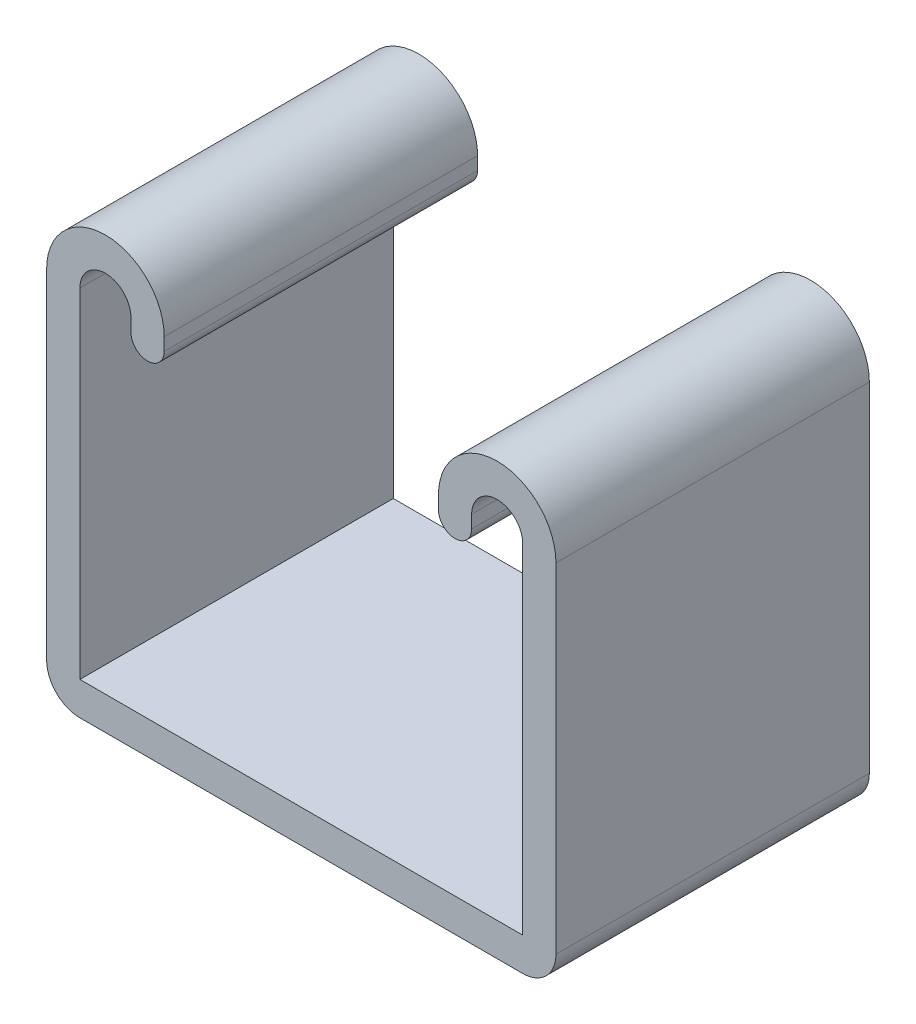
ISO-10303-21;
HEADER;
FILE_DESCRIPTION(('STEP AP214'),'2;1');
FILE_NAME('part.step','',(''),(''),'','','');
FILE_SCHEMA(('AUTOMOTIVE_DESIGN { 1 0 10303 214 1 1 1 1 }'));
ENDSEC;
DATA;
#1=APPLICATION_CONTEXT('core data for automotive mechanical design processes');
#2=APPLICATION_PROTOCOL_DEFINITION('international standard','automotive_design',2000,#1);
#3=PRODUCT_CONTEXT('',#1,'mechanical');
#4=PRODUCT('Part','Part','',(#3));
#5=PRODUCT_RELATED_PRODUCT_CATEGORY('part','',(#4));
#6=PRODUCT_DEFINITION_FORMATION('','',#4);
#7=PRODUCT_DEFINITION_CONTEXT('part definition',#1,'design');
#8=PRODUCT_DEFINITION('design','',#6,#7);
#9=PRODUCT_DEFINITION_SHAPE('','',#8);
#10=(LENGTH_UNIT() NAMED_UNIT(*) SI_UNIT(.MILLI.,.METRE.));
#11=(NAMED_UNIT(*) PLANE_ANGLE_UNIT() SI_UNIT($,.RADIAN.));
#12=(NAMED_UNIT(*) SI_UNIT($,.STERADIAN.) SOLID_ANGLE_UNIT());
#13=UNCERTAINTY_MEASURE_WITH_UNIT(LENGTH_MEASURE(1.E-05),#10,'distance_accuracy_value','');
#14=(GEOMETRIC_REPRESENTATION_CONTEXT(3) GLOBAL_UNCERTAINTY_ASSIGNED_CONTEXT((#13)) GLOBAL_UNIT_ASSIGNED_CONTEXT((#10,
#11,#12)) REPRESENTATION_CONTEXT('',''));
#15=CARTESIAN_POINT('',(0.,0.,0.));
#16=DIRECTION('',(0.,0.,1.));
#17=DIRECTION('',(1.,0.,0.));
#18=AXIS2_PLACEMENT_3D('',#15,#16,#17);
#19=CARTESIAN_POINT('',(-15.875,15.1511,12.7));
#20=DIRECTION('',(0.,0.,-1.));
#21=DIRECTION('',(-1.,0.,0.));
#22=AXIS2_PLACEMENT_3D('',#19,#20,#21);
#23=CYLINDRICAL_SURFACE('',#22,4.7625);
#24=CARTESIAN_POINT('',(-15.875,15.1511,-12.7));
#25=DIRECTION('',(0.,0.,1.));
#26=DIRECTION('',(-1.,0.,0.));
#27=AXIS2_PLACEMENT_3D('',#24,#25,#26);
#28=CIRCLE('',#27,4.7625);
#29=CARTESIAN_POINT('',(-11.1125,15.1511,-12.7));
#30=VERTEX_POINT('',#29);
#31=CARTESIAN_POINT('',(-20.6375,15.1511,-12.7));
#32=VERTEX_POINT('',#31);
#33=EDGE_CURVE('E188',#30,#32,#28,.T.);
#34=ORIENTED_EDGE('',*,*,#33,.T.);
#35=DIRECTION('',(0.,0.,-1.));
#36=VECTOR('',#35,1.);
#37=CARTESIAN_POINT('',(-20.6375,15.1511,12.7));
#38=LINE('',#37,#36);
#39=CARTESIAN_POINT('',(-20.6375,15.1511,12.7));
#40=VERTEX_POINT('',#39);
#41=EDGE_CURVE('E11',#40,#32,#38,.T.);
#42=ORIENTED_EDGE('',*,*,#41,.F.);
#43=CARTESIAN_POINT('',(-15.875,15.1511,12.7));
#44=DIRECTION('',(0.,0.,1.));
#45=DIRECTION('',(-1.,0.,0.));
#46=AXIS2_PLACEMENT_3D('',#43,#44,#45);
#47=CIRCLE('',#46,4.7625);
#48=CARTESIAN_POINT('',(-11.1125,15.1511,12.7));
#49=VERTEX_POINT('',#48);
#50=EDGE_CURVE('E222',#49,#40,#47,.T.);
#51=ORIENTED_EDGE('',*,*,#50,.F.);
#52=DIRECTION('',(0.,0.,-1.));
#53=VECTOR('',#52,1.);
#54=CARTESIAN_POINT('',(-11.1125,15.1511,12.7));
#55=LINE('',#54,#53);
#56=EDGE_CURVE('E184',#49,#30,#55,.T.);
#57=ORIENTED_EDGE('',*,*,#56,.T.);
#58=EDGE_LOOP('',(#34,#42,#51,#57));
#59=FACE_BOUND('',#58,.T.);
#60=ADVANCED_FACE('F32',(#59),#23,.T.);
#61=CARTESIAN_POINT('',(-20.6375,15.1511,12.7));
#62=DIRECTION('',(1.,0.,0.));
#63=DIRECTION('',(0.,1.,0.));
#64=AXIS2_PLACEMENT_3D('',#61,#62,#63);
#65=PLANE('',#64);
#66=DIRECTION('',(0.,-1.,0.));
#67=VECTOR('',#66,1.);
#68=CARTESIAN_POINT('',(-20.6375,15.1511,-12.7));
#69=LINE('',#68,#67);
#70=CARTESIAN_POINT('',(-20.6375,-12.319,-12.7));
#71=VERTEX_POINT('',#70);
#72=EDGE_CURVE('E191',#32,#71,#69,.T.);
#73=ORIENTED_EDGE('',*,*,#72,.T.);
#74=DIRECTION('',(0.,0.,-1.));
#75=VECTOR('',#74,1.);
#76=CARTESIAN_POINT('',(-20.6375,-12.319,12.7));
#77=LINE('',#76,#75);
#78=CARTESIAN_POINT('',(-20.6375,-12.319,12.7));
#79=VERTEX_POINT('',#78);
#80=EDGE_CURVE('E40',#79,#71,#77,.T.);
#81=ORIENTED_EDGE('',*,*,#80,.F.);
#82=DIRECTION('',(0.,-1.,0.));
#83=VECTOR('',#82,1.);
#84=CARTESIAN_POINT('',(-20.6375,15.1511,12.7));
#85=LINE('',#84,#83);
#86=EDGE_CURVE('E121',#40,#79,#85,.T.);
#87=ORIENTED_EDGE('',*,*,#86,.F.);
#88=ORIENTED_EDGE('',*,*,#41,.T.);
#89=EDGE_LOOP('',(#73,#81,#87,#88));
#90=FACE_BOUND('',#89,.T.);
#91=ADVANCED_FACE('F330',(#90),#65,.F.);
#92=CARTESIAN_POINT('',(-17.9451,-12.319,12.7));
#93=DIRECTION('',(0.,0.,-1.));
#94=DIRECTION('',(-1.,0.,0.));
#95=AXIS2_PLACEMENT_3D('',#92,#93,#94);
#96=CYLINDRICAL_SURFACE('',#95,2.6924);
#97=CARTESIAN_POINT('',(-17.9451,-12.319,-12.7));
#98=DIRECTION('',(0.,0.,1.));
#99=DIRECTION('',(-1.,0.,0.));
#100=AXIS2_PLACEMENT_3D('',#97,#98,#99);
#101=CIRCLE('',#100,2.6924);
#102=CARTESIAN_POINT('',(-17.9451,-15.0114,-12.7));
#103=VERTEX_POINT('',#102);
#104=EDGE_CURVE('E193',#71,#103,#101,.T.);
#105=ORIENTED_EDGE('',*,*,#104,.T.);
#106=DIRECTION('',(0.,0.,-1.));
#107=VECTOR('',#106,1.);
#108=CARTESIAN_POINT('',(-17.9451,-15.0114,12.7));
#109=LINE('',#108,#107);
#110=CARTESIAN_POINT('',(-17.9451,-15.0114,12.7));
#111=VERTEX_POINT('',#110);
#112=EDGE_CURVE('E259',#111,#103,#109,.T.);
#113=ORIENTED_EDGE('',*,*,#112,.F.);
#114=CARTESIAN_POINT('',(-17.9451,-12.319,12.7));
#115=DIRECTION('',(0.,0.,1.));
#116=DIRECTION('',(-1.,0.,0.));
#117=AXIS2_PLACEMENT_3D('',#114,#115,#116);
#118=CIRCLE('',#117,2.6924);
#119=EDGE_CURVE('E267',#79,#111,#118,.T.);
#120=ORIENTED_EDGE('',*,*,#119,.F.);
#121=ORIENTED_EDGE('',*,*,#80,.T.);
#122=EDGE_LOOP('',(#105,#113,#120,#121));
#123=FACE_BOUND('',#122,.T.);
#124=ADVANCED_FACE('F265',(#123),#96,.T.);
#125=CARTESIAN_POINT('',(-17.9451,-15.0114,12.7));
#126=DIRECTION('',(0.,1.,0.));
#127=DIRECTION('',(-1.,0.,0.));
#128=AXIS2_PLACEMENT_3D('',#125,#126,#127);
#129=PLANE('',#128);
#130=DIRECTION('',(1.,0.,0.));
#131=VECTOR('',#130,1.);
#132=CARTESIAN_POINT('',(-17.9451,-15.0114,-12.7));
#133=LINE('',#132,#131);
#134=CARTESIAN_POINT('',(17.9451,-15.0114,-12.7));
#135=VERTEX_POINT('',#134);
#136=EDGE_CURVE('E195',#103,#135,#133,.T.);
#137=ORIENTED_EDGE('',*,*,#136,.T.);
#138=DIRECTION('',(0.,0.,-1.));
#139=VECTOR('',#138,1.);
#140=CARTESIAN_POINT('',(17.9451,-15.0114,12.7));
#141=LINE('',#140,#139);
#142=CARTESIAN_POINT('',(17.9451,-15.0114,12.7));
#143=VERTEX_POINT('',#142);
#144=EDGE_CURVE('E256',#143,#135,#141,.T.);
#145=ORIENTED_EDGE('',*,*,#144,.F.);
#146=DIRECTION('',(1.,0.,0.));
#147=VECTOR('',#146,1.);
#148=CARTESIAN_POINT('',(-17.9451,-15.0114,12.7));
#149=LINE('',#148,#147);
#150=EDGE_CURVE('E285',#111,#143,#149,.T.);
#151=ORIENTED_EDGE('',*,*,#150,.F.);
#152=ORIENTED_EDGE('',*,*,#112,.T.);
#153=EDGE_LOOP('',(#137,#145,#151,#152));
#154=FACE_BOUND('',#153,.T.);
#155=ADVANCED_FACE('F276',(#154),#129,.F.);
#156=CARTESIAN_POINT('',(17.9451,-12.319,12.7));
#157=DIRECTION('',(0.,0.,-1.));
#158=DIRECTION('',(-1.,0.,0.));
#159=AXIS2_PLACEMENT_3D('',#156,#157,#158);
#160=CYLINDRICAL_SURFACE('',#159,2.6924);
#161=CARTESIAN_POINT('',(17.9451,-12.319,-12.7));
#162=DIRECTION('',(0.,0.,1.));
#163=DIRECTION('',(1.,0.,0.));
#164=AXIS2_PLACEMENT_3D('',#161,#162,#163);
#165=CIRCLE('',#164,2.6924);
#166=CARTESIAN_POINT('',(20.6375,-12.319,-12.7));
#167=VERTEX_POINT('',#166);
#168=EDGE_CURVE('E197',#135,#167,#165,.T.);
#169=ORIENTED_EDGE('',*,*,#168,.T.);
#170=DIRECTION('',(0.,0.,-1.));
#171=VECTOR('',#170,1.);
#172=CARTESIAN_POINT('',(20.6375,-12.319,12.7));
#173=LINE('',#172,#171);
#174=CARTESIAN_POINT('',(20.6375,-12.319,12.7));
#175=VERTEX_POINT('',#174);
#176=EDGE_CURVE('E253',#175,#167,#173,.T.);
#177=ORIENTED_EDGE('',*,*,#176,.F.);
#178=CARTESIAN_POINT('',(17.9451,-12.319,12.7));
#179=DIRECTION('',(0.,0.,1.));
#180=DIRECTION('',(1.,0.,0.));
#181=AXIS2_PLACEMENT_3D('',#178,#179,#180);
#182=CIRCLE('',#181,2.6924);
#183=EDGE_CURVE('E282',#143,#175,#182,.T.);
#184=ORIENTED_EDGE('',*,*,#183,.F.);
#185=ORIENTED_EDGE('',*,*,#144,.T.);
#186=EDGE_LOOP('',(#169,#177,#184,#185));
#187=FACE_BOUND('',#186,.T.);
#188=ADVANCED_FACE('F280',(#187),#160,.T.);
#189=CARTESIAN_POINT('',(20.6375,-12.319,12.7));
#190=DIRECTION('',(-1.,0.,0.));
#191=DIRECTION('',(0.,0.,1.));
#192=AXIS2_PLACEMENT_3D('',#189,#190,#191);
#193=PLANE('',#192);
#194=DIRECTION('',(0.,1.,0.));
#195=VECTOR('',#194,1.);
#196=CARTESIAN_POINT('',(20.6375,-12.319,-12.7));
#197=LINE('',#196,#195);
#198=CARTESIAN_POINT('',(20.6375,15.1511,-12.7));
#199=VERTEX_POINT('',#198);
#200=EDGE_CURVE('E199',#167,#199,#197,.T.);
#201=ORIENTED_EDGE('',*,*,#200,.T.);
#202=DIRECTION('',(0.,0.,-1.));
#203=VECTOR('',#202,1.);
#204=CARTESIAN_POINT('',(20.6375,15.1511,12.7));
#205=LINE('',#204,#203);
#206=CARTESIAN_POINT('',(20.6375,15.1511,12.7));
#207=VERTEX_POINT('',#206);
#208=EDGE_CURVE('E250',#207,#199,#205,.T.);
#209=ORIENTED_EDGE('',*,*,#208,.F.);
#210=DIRECTION('',(0.,1.,0.));
#211=VECTOR('',#210,1.);
#212=CARTESIAN_POINT('',(20.6375,-12.319,12.7));
#213=LINE('',#212,#211);
#214=EDGE_CURVE('E284',#175,#207,#213,.T.);
#215=ORIENTED_EDGE('',*,*,#214,.F.);
#216=ORIENTED_EDGE('',*,*,#176,.T.);
#217=EDGE_LOOP('',(#201,#209,#215,#216));
#218=FACE_BOUND('',#217,.T.);
#219=ADVANCED_FACE('F343',(#218),#193,.F.);
#220=CARTESIAN_POINT('',(15.875,15.1511,12.7));
#221=DIRECTION('',(0.,0.,-1.));
#222=DIRECTION('',(-1.,0.,0.));
#223=AXIS2_PLACEMENT_3D('',#220,#221,#222);
#224=CYLINDRICAL_SURFACE('',#223,4.7625);
#225=CARTESIAN_POINT('',(15.875,15.1511,-12.7));
#226=DIRECTION('',(0.,0.,1.));
#227=DIRECTION('',(1.,0.,0.));
#228=AXIS2_PLACEMENT_3D('',#225,#226,#227);
#229=CIRCLE('',#228,4.7625);
#230=CARTESIAN_POINT('',(11.1125,15.1511,-12.7));
#231=VERTEX_POINT('',#230);
#232=EDGE_CURVE('E201',#199,#231,#229,.T.);
#233=ORIENTED_EDGE('',*,*,#232,.T.);
#234=DIRECTION('',(0.,0.,-1.));
#235=VECTOR('',#234,1.);
#236=CARTESIAN_POINT('',(11.1125,15.1511,12.7));
#237=LINE('',#236,#235);
#238=CARTESIAN_POINT('',(11.1125,15.1511,12.7));
#239=VERTEX_POINT('',#238);
#240=EDGE_CURVE('E247',#239,#231,#237,.T.);
#241=ORIENTED_EDGE('',*,*,#240,.F.);
#242=CARTESIAN_POINT('',(15.875,15.1511,12.7));
#243=DIRECTION('',(0.,0.,1.));
#244=DIRECTION('',(1.,0.,0.));
#245=AXIS2_PLACEMENT_3D('',#242,#243,#244);
#246=CIRCLE('',#245,4.7625);
#247=EDGE_CURVE('E287',#207,#239,#246,.T.);
#248=ORIENTED_EDGE('',*,*,#247,.F.);
#249=ORIENTED_EDGE('',*,*,#208,.T.);
#250=EDGE_LOOP('',(#233,#241,#248,#249));
#251=FACE_BOUND('',#250,.T.);
#252=ADVANCED_FACE('F346',(#251),#224,.T.);
#253=CARTESIAN_POINT('',(11.1125,15.1511,12.7));
#254=DIRECTION('',(1.,0.,0.));
#255=DIRECTION('',(0.,1.,0.));
#256=AXIS2_PLACEMENT_3D('',#253,#254,#255);
#257=PLANE('',#256);
#258=DIRECTION('',(0.,-1.,0.));
#259=VECTOR('',#258,1.);
#260=CARTESIAN_POINT('',(11.1125,15.1511,-12.7));
#261=LINE('',#260,#259);
#262=CARTESIAN_POINT('',(11.1125,14.11605,-12.7));
#263=VERTEX_POINT('',#262);
#264=EDGE_CURVE('E203',#231,#263,#261,.T.);
#265=ORIENTED_EDGE('',*,*,#264,.T.);
#266=DIRECTION('',(0.,0.,-1.));
#267=VECTOR('',#266,1.);
#268=CARTESIAN_POINT('',(11.1125,14.11605,12.7));
#269=LINE('',#268,#267);
#270=CARTESIAN_POINT('',(11.1125,14.11605,12.7));
#271=VERTEX_POINT('',#270);
#272=EDGE_CURVE('E244',#271,#263,#269,.T.);
#273=ORIENTED_EDGE('',*,*,#272,.F.);
#274=DIRECTION('',(0.,-1.,0.));
#275=VECTOR('',#274,1.);
#276=CARTESIAN_POINT('',(11.1125,15.1511,12.7));
#277=LINE('',#276,#275);
#278=EDGE_CURVE('E293',#239,#271,#277,.T.);
#279=ORIENTED_EDGE('',*,*,#278,.F.);
#280=ORIENTED_EDGE('',*,*,#240,.T.);
#281=EDGE_LOOP('',(#265,#273,#279,#280));
#282=FACE_BOUND('',#281,.T.);
#283=ADVANCED_FACE('F350',(#282),#257,.F.);
#284=CARTESIAN_POINT('',(12.4587,14.11605,12.7));
#285=DIRECTION('',(0.,0.,-1.));
#286=DIRECTION('',(-1.,0.,0.));
#287=AXIS2_PLACEMENT_3D('',#284,#285,#286);
#288=CYLINDRICAL_SURFACE('',#287,1.3462);
#289=CARTESIAN_POINT('',(12.4587,14.11605,-12.7));
#290=DIRECTION('',(0.,0.,1.));
#291=DIRECTION('',(1.,0.,0.));
#292=AXIS2_PLACEMENT_3D('',#289,#290,#291);
#293=CIRCLE('',#292,1.3462);
#294=CARTESIAN_POINT('',(13.8049,14.11605,-12.7));
#295=VERTEX_POINT('',#294);
#296=EDGE_CURVE('E205',#263,#295,#293,.T.);
#297=ORIENTED_EDGE('',*,*,#296,.T.);
#298=DIRECTION('',(0.,0.,-1.));
#299=VECTOR('',#298,1.);
#300=CARTESIAN_POINT('',(13.8049,14.11605,12.7));
#301=LINE('',#300,#299);
#302=CARTESIAN_POINT('',(13.8049,14.11605,12.7));
#303=VERTEX_POINT('',#302);
#304=EDGE_CURVE('E241',#303,#295,#301,.T.);
#305=ORIENTED_EDGE('',*,*,#304,.F.);
#306=CARTESIAN_POINT('',(12.4587,14.11605,12.7));
#307=DIRECTION('',(0.,0.,1.));
#308=DIRECTION('',(1.,0.,0.));
#309=AXIS2_PLACEMENT_3D('',#306,#307,#308);
#310=CIRCLE('',#309,1.3462);
#311=EDGE_CURVE('E295',#271,#303,#310,.T.);
#312=ORIENTED_EDGE('',*,*,#311,.F.);
#313=ORIENTED_EDGE('',*,*,#272,.T.);
#314=EDGE_LOOP('',(#297,#305,#312,#313));
#315=FACE_BOUND('',#314,.T.);
#316=ADVANCED_FACE('F354',(#315),#288,.T.);
#317=CARTESIAN_POINT('',(13.8049,15.1511,12.7));
#318=DIRECTION('',(-1.,0.,0.));
#319=DIRECTION('',(0.,0.,1.));
#320=AXIS2_PLACEMENT_3D('',#317,#318,#319);
#321=PLANE('',#320);
#322=DIRECTION('',(0.,1.,0.));
#323=VECTOR('',#322,1.);
#324=CARTESIAN_POINT('',(13.8049,15.1511,-12.7));
#325=LINE('',#324,#323);
#326=CARTESIAN_POINT('',(13.8049,15.1511,-12.7));
#327=VERTEX_POINT('',#326);
#328=EDGE_CURVE('E207',#295,#327,#325,.T.);
#329=ORIENTED_EDGE('',*,*,#328,.T.);
#330=DIRECTION('',(0.,0.,-1.));
#331=VECTOR('',#330,1.);
#332=CARTESIAN_POINT('',(13.8049,15.1511,12.7));
#333=LINE('',#332,#331);
#334=CARTESIAN_POINT('',(13.8049,15.1511,12.7));
#335=VERTEX_POINT('',#334);
#336=EDGE_CURVE('E238',#335,#327,#333,.T.);
#337=ORIENTED_EDGE('',*,*,#336,.F.);
#338=DIRECTION('',(0.,1.,0.));
#339=VECTOR('',#338,1.);
#340=CARTESIAN_POINT('',(13.8049,15.1511,12.7));
#341=LINE('',#340,#339);
#342=EDGE_CURVE('E297',#303,#335,#341,.T.);
#343=ORIENTED_EDGE('',*,*,#342,.F.);
#344=ORIENTED_EDGE('',*,*,#304,.T.);
#345=EDGE_LOOP('',(#329,#337,#343,#344));
#346=FACE_BOUND('',#345,.T.);
#347=ADVANCED_FACE('F358',(#346),#321,.F.);
#348=CARTESIAN_POINT('',(15.875,15.1511,12.7));
#349=DIRECTION('',(0.,0.,-1.));
#350=DIRECTION('',(-1.,0.,0.));
#351=AXIS2_PLACEMENT_3D('',#348,#349,#350);
#352=CYLINDRICAL_SURFACE('',#351,2.0701);
#353=CARTESIAN_POINT('',(15.875,15.1511,-12.7));
#354=DIRECTION('',(0.,0.,-1.));
#355=DIRECTION('',(1.,0.,0.));
#356=AXIS2_PLACEMENT_3D('',#353,#354,#355);
#357=CIRCLE('',#356,2.0701);
#358=CARTESIAN_POINT('',(17.9451,15.1511,-12.7));
#359=VERTEX_POINT('',#358);
#360=EDGE_CURVE('E209',#327,#359,#357,.T.);
#361=ORIENTED_EDGE('',*,*,#360,.T.);
#362=DIRECTION('',(0.,0.,-1.));
#363=VECTOR('',#362,1.);
#364=CARTESIAN_POINT('',(17.9451,15.1511,12.7));
#365=LINE('',#364,#363);
#366=CARTESIAN_POINT('',(17.9451,15.1511,12.7));
#367=VERTEX_POINT('',#366);
#368=EDGE_CURVE('E235',#367,#359,#365,.T.);
#369=ORIENTED_EDGE('',*,*,#368,.F.);
#370=CARTESIAN_POINT('',(15.875,15.1511,12.7));
#371=DIRECTION('',(0.,0.,-1.));
#372=DIRECTION('',(1.,0.,0.));
#373=AXIS2_PLACEMENT_3D('',#370,#371,#372);
#374=CIRCLE('',#373,2.0701);
#375=EDGE_CURVE('E299',#335,#367,#374,.T.);
#376=ORIENTED_EDGE('',*,*,#375,.F.);
#377=ORIENTED_EDGE('',*,*,#336,.T.);
#378=EDGE_LOOP('',(#361,#369,#376,#377));
#379=FACE_BOUND('',#378,.T.);
#380=ADVANCED_FACE('F362',(#379),#352,.F.);
#381=CARTESIAN_POINT('',(17.9451,-12.319,12.7));
#382=DIRECTION('',(1.,0.,0.));
#383=DIRECTION('',(0.,1.,0.));
#384=AXIS2_PLACEMENT_3D('',#381,#382,#383);
#385=PLANE('',#384);
#386=DIRECTION('',(0.,-1.,0.));
#387=VECTOR('',#386,1.);
#388=CARTESIAN_POINT('',(17.9451,-12.319,-12.7));
#389=LINE('',#388,#387);
#390=CARTESIAN_POINT('',(17.9451,-12.319,-12.7));
#391=VERTEX_POINT('',#390);
#392=EDGE_CURVE('E211',#359,#391,#389,.T.);
#393=ORIENTED_EDGE('',*,*,#392,.T.);
#394=DIRECTION('',(0.,0.,-1.));
#395=VECTOR('',#394,1.);
#396=CARTESIAN_POINT('',(17.9451,-12.319,12.7));
#397=LINE('',#396,#395);
#398=CARTESIAN_POINT('',(17.9451,-12.319,12.7));
#399=VERTEX_POINT('',#398);
#400=EDGE_CURVE('E232',#399,#391,#397,.T.);
#401=ORIENTED_EDGE('',*,*,#400,.F.);
#402=DIRECTION('',(0.,-1.,0.));
#403=VECTOR('',#402,1.);
#404=CARTESIAN_POINT('',(17.9451,-12.319,12.7));
#405=LINE('',#404,#403);
#406=EDGE_CURVE('E301',#367,#399,#405,.T.);
#407=ORIENTED_EDGE('',*,*,#406,.F.);
#408=ORIENTED_EDGE('',*,*,#368,.T.);
#409=EDGE_LOOP('',(#393,#401,#407,#408));
#410=FACE_BOUND('',#409,.T.);
#411=ADVANCED_FACE('F366',(#410),#385,.F.);
#412=CARTESIAN_POINT('',(-17.9451,-12.319,12.7));
#413=DIRECTION('',(0.,-1.,0.));
#414=DIRECTION('',(0.,0.,-1.));
#415=AXIS2_PLACEMENT_3D('',#412,#413,#414);
#416=PLANE('',#415);
#417=DIRECTION('',(-1.,0.,0.));
#418=VECTOR('',#417,1.);
#419=CARTESIAN_POINT('',(-17.9451,-12.319,-12.7));
#420=LINE('',#419,#418);
#421=CARTESIAN_POINT('',(-17.9451,-12.319,-12.7));
#422=VERTEX_POINT('',#421);
#423=EDGE_CURVE('E213',#391,#422,#420,.T.);
#424=ORIENTED_EDGE('',*,*,#423,.T.);
#425=DIRECTION('',(0.,0.,-1.));
#426=VECTOR('',#425,1.);
#427=CARTESIAN_POINT('',(-17.9451,-12.319,12.7));
#428=LINE('',#427,#426);
#429=CARTESIAN_POINT('',(-17.9451,-12.319,12.7));
#430=VERTEX_POINT('',#429);
#431=EDGE_CURVE('E229',#430,#422,#428,.T.);
#432=ORIENTED_EDGE('',*,*,#431,.F.);
#433=DIRECTION('',(-1.,0.,0.));
#434=VECTOR('',#433,1.);
#435=CARTESIAN_POINT('',(-17.9451,-12.319,12.7));
#436=LINE('',#435,#434);
#437=EDGE_CURVE('E303',#399,#430,#436,.T.);
#438=ORIENTED_EDGE('',*,*,#437,.F.);
#439=ORIENTED_EDGE('',*,*,#400,.T.);
#440=EDGE_LOOP('',(#424,#432,#438,#439));
#441=FACE_BOUND('',#440,.T.);
#442=ADVANCED_FACE('F370',(#441),#416,.F.);
#443=CARTESIAN_POINT('',(-17.9451,15.1511,12.7));
#444=DIRECTION('',(-1.,0.,0.));
#445=DIRECTION('',(0.,0.,1.));
#446=AXIS2_PLACEMENT_3D('',#443,#444,#445);
#447=PLANE('',#446);
#448=DIRECTION('',(0.,1.,0.));
#449=VECTOR('',#448,1.);
#450=CARTESIAN_POINT('',(-17.9451,15.1511,-12.7));
#451=LINE('',#450,#449);
#452=CARTESIAN_POINT('',(-17.9451,15.1511,-12.7));
#453=VERTEX_POINT('',#452);
#454=EDGE_CURVE('E215',#422,#453,#451,.T.);
#455=ORIENTED_EDGE('',*,*,#454,.T.);
#456=DIRECTION('',(0.,0.,-1.));
#457=VECTOR('',#456,1.);
#458=CARTESIAN_POINT('',(-17.9451,15.1511,12.7));
#459=LINE('',#458,#457);
#460=CARTESIAN_POINT('',(-17.9451,15.1511,12.7));
#461=VERTEX_POINT('',#460);
#462=EDGE_CURVE('E226',#461,#453,#459,.T.);
#463=ORIENTED_EDGE('',*,*,#462,.F.);
#464=DIRECTION('',(0.,1.,0.));
#465=VECTOR('',#464,1.);
#466=CARTESIAN_POINT('',(-17.9451,15.1511,12.7));
#467=LINE('',#466,#465);
#468=EDGE_CURVE('E305',#430,#461,#467,.T.);
#469=ORIENTED_EDGE('',*,*,#468,.F.);
#470=ORIENTED_EDGE('',*,*,#431,.T.);
#471=EDGE_LOOP('',(#455,#463,#469,#470));
#472=FACE_BOUND('',#471,.T.);
#473=ADVANCED_FACE('F311',(#472),#447,.F.);
#474=CARTESIAN_POINT('',(-15.875,15.1511,12.7));
#475=DIRECTION('',(0.,0.,-1.));
#476=DIRECTION('',(-1.,0.,0.));
#477=AXIS2_PLACEMENT_3D('',#474,#475,#476);
#478=CYLINDRICAL_SURFACE('',#477,2.0701);
#479=CARTESIAN_POINT('',(-15.875,15.1511,-12.7));
#480=DIRECTION('',(0.,0.,-1.));
#481=DIRECTION('',(-1.,0.,0.));
#482=AXIS2_PLACEMENT_3D('',#479,#480,#481);
#483=CIRCLE('',#482,2.0701);
#484=CARTESIAN_POINT('',(-13.8049,15.1511,-12.7));
#485=VERTEX_POINT('',#484);
#486=EDGE_CURVE('E217',#453,#485,#483,.T.);
#487=ORIENTED_EDGE('',*,*,#486,.T.);
#488=DIRECTION('',(0.,0.,-1.));
#489=VECTOR('',#488,1.);
#490=CARTESIAN_POINT('',(-13.8049,15.1511,12.7));
#491=LINE('',#490,#489);
#492=CARTESIAN_POINT('',(-13.8049,15.1511,12.7));
#493=VERTEX_POINT('',#492);
#494=EDGE_CURVE('E179',#493,#485,#491,.T.);
#495=ORIENTED_EDGE('',*,*,#494,.F.);
#496=CARTESIAN_POINT('',(-15.875,15.1511,12.7));
#497=DIRECTION('',(0.,0.,-1.));
#498=DIRECTION('',(-1.,0.,0.));
#499=AXIS2_PLACEMENT_3D('',#496,#497,#498);
#500=CIRCLE('',#499,2.0701);
#501=EDGE_CURVE('E170',#461,#493,#500,.T.);
#502=ORIENTED_EDGE('',*,*,#501,.F.);
#503=ORIENTED_EDGE('',*,*,#462,.T.);
#504=EDGE_LOOP('',(#487,#495,#502,#503));
#505=FACE_BOUND('',#504,.T.);
#506=ADVANCED_FACE('F315',(#505),#478,.F.);
#507=CARTESIAN_POINT('',(-13.8049,15.1511,12.7));
#508=DIRECTION('',(1.,0.,0.));
#509=DIRECTION('',(0.,1.,0.));
#510=AXIS2_PLACEMENT_3D('',#507,#508,#509);
#511=PLANE('',#510);
#512=DIRECTION('',(0.,-1.,0.));
#513=VECTOR('',#512,1.);
#514=CARTESIAN_POINT('',(-13.8049,15.1511,-12.7));
#515=LINE('',#514,#513);
#516=CARTESIAN_POINT('',(-13.8049,14.11605,-12.7));
#517=VERTEX_POINT('',#516);
#518=EDGE_CURVE('E178',#485,#517,#515,.T.);
#519=ORIENTED_EDGE('',*,*,#518,.T.);
#520=DIRECTION('',(0.,0.,-1.));
#521=VECTOR('',#520,1.);
#522=CARTESIAN_POINT('',(-13.8049,14.11605,12.7));
#523=LINE('',#522,#521);
#524=CARTESIAN_POINT('',(-13.8049,14.11605,12.7));
#525=VERTEX_POINT('',#524);
#526=EDGE_CURVE('E175',#525,#517,#523,.T.);
#527=ORIENTED_EDGE('',*,*,#526,.F.);
#528=DIRECTION('',(0.,-1.,0.));
#529=VECTOR('',#528,1.);
#530=CARTESIAN_POINT('',(-13.8049,15.1511,12.7));
#531=LINE('',#530,#529);
#532=EDGE_CURVE('E164',#493,#525,#531,.T.);
#533=ORIENTED_EDGE('',*,*,#532,.F.);
#534=ORIENTED_EDGE('',*,*,#494,.T.);
#535=EDGE_LOOP('',(#519,#527,#533,#534));
#536=FACE_BOUND('',#535,.T.);
#537=ADVANCED_FACE('F176',(#536),#511,.F.);
#538=CARTESIAN_POINT('',(-12.4587,14.11605,12.7));
#539=DIRECTION('',(0.,0.,-1.));
#540=DIRECTION('',(-1.,0.,0.));
#541=AXIS2_PLACEMENT_3D('',#538,#539,#540);
#542=CYLINDRICAL_SURFACE('',#541,1.3462);
#543=CARTESIAN_POINT('',(-12.4587,14.11605,-12.7));
#544=DIRECTION('',(0.,0.,1.));
#545=DIRECTION('',(-1.,0.,0.));
#546=AXIS2_PLACEMENT_3D('',#543,#544,#545);
#547=CIRCLE('',#546,1.3462);
#548=CARTESIAN_POINT('',(-11.1125,14.11605,-12.7));
#549=VERTEX_POINT('',#548);
#550=EDGE_CURVE('E107',#517,#549,#547,.T.);
#551=ORIENTED_EDGE('',*,*,#550,.T.);
#552=DIRECTION('',(0.,0.,-1.));
#553=VECTOR('',#552,1.);
#554=CARTESIAN_POINT('',(-11.1125,14.11605,12.7));
#555=LINE('',#554,#553);
#556=CARTESIAN_POINT('',(-11.1125,14.11605,12.7));
#557=VERTEX_POINT('',#556);
#558=EDGE_CURVE('E180',#557,#549,#555,.T.);
#559=ORIENTED_EDGE('',*,*,#558,.F.);
#560=CARTESIAN_POINT('',(-12.4587,14.11605,12.7));
#561=DIRECTION('',(0.,0.,1.));
#562=DIRECTION('',(-1.,0.,0.));
#563=AXIS2_PLACEMENT_3D('',#560,#561,#562);
#564=CIRCLE('',#563,1.3462);
#565=EDGE_CURVE('E168',#525,#557,#564,.T.);
#566=ORIENTED_EDGE('',*,*,#565,.F.);
#567=ORIENTED_EDGE('',*,*,#526,.T.);
#568=EDGE_LOOP('',(#551,#559,#566,#567));
#569=FACE_BOUND('',#568,.T.);
#570=ADVANCED_FACE('F182',(#569),#542,.T.);
#571=CARTESIAN_POINT('',(-11.1125,15.1511,12.7));
#572=DIRECTION('',(-1.,0.,0.));
#573=DIRECTION('',(0.,0.,1.));
#574=AXIS2_PLACEMENT_3D('',#571,#572,#573);
#575=PLANE('',#574);
#576=DIRECTION('',(0.,1.,0.));
#577=VECTOR('',#576,1.);
#578=CARTESIAN_POINT('',(-11.1125,15.1511,-12.7));
#579=LINE('',#578,#577);
#580=EDGE_CURVE('E113',#549,#30,#579,.T.);
#581=ORIENTED_EDGE('',*,*,#580,.T.);
#582=ORIENTED_EDGE('',*,*,#56,.F.);
#583=DIRECTION('',(0.,1.,0.));
#584=VECTOR('',#583,1.);
#585=CARTESIAN_POINT('',(-11.1125,15.1511,12.7));
#586=LINE('',#585,#584);
#587=EDGE_CURVE('E48',#557,#49,#586,.T.);
#588=ORIENTED_EDGE('',*,*,#587,.F.);
#589=ORIENTED_EDGE('',*,*,#558,.T.);
#590=EDGE_LOOP('',(#581,#582,#588,#589));
#591=FACE_BOUND('',#590,.T.);
#592=ADVANCED_FACE('F319',(#591),#575,.F.);
#593=CARTESIAN_POINT('',(-15.875,15.1511,12.7));
#594=DIRECTION('',(0.,0.,-1.));
#595=DIRECTION('',(-1.,0.,0.));
#596=AXIS2_PLACEMENT_3D('',#593,#594,#595);
#597=PLANE('',#596);
#598=ORIENTED_EDGE('',*,*,#50,.T.);
#599=ORIENTED_EDGE('',*,*,#86,.T.);
#600=ORIENTED_EDGE('',*,*,#119,.T.);
#601=ORIENTED_EDGE('',*,*,#150,.T.);
#602=ORIENTED_EDGE('',*,*,#183,.T.);
#603=ORIENTED_EDGE('',*,*,#214,.T.);
#604=ORIENTED_EDGE('',*,*,#247,.T.);
#605=ORIENTED_EDGE('',*,*,#278,.T.);
#606=ORIENTED_EDGE('',*,*,#311,.T.);
#607=ORIENTED_EDGE('',*,*,#342,.T.);
#608=ORIENTED_EDGE('',*,*,#375,.T.);
#609=ORIENTED_EDGE('',*,*,#406,.T.);
#610=ORIENTED_EDGE('',*,*,#437,.T.);
#611=ORIENTED_EDGE('',*,*,#468,.T.);
#612=ORIENTED_EDGE('',*,*,#501,.T.);
#613=ORIENTED_EDGE('',*,*,#532,.T.);
#614=ORIENTED_EDGE('',*,*,#565,.T.);
#615=ORIENTED_EDGE('',*,*,#587,.T.);
#616=EDGE_LOOP('',(#598,#599,#600,#601,#602,#603,#604,#605,#606,#607,#608,#609,#610,#611,#612,
#613,#614,#615));
#617=FACE_BOUND('',#616,.T.);
#618=ADVANCED_FACE('F166',(#617),#597,.F.);
#619=CARTESIAN_POINT('',(-15.875,15.1511,-12.7));
#620=DIRECTION('',(0.,0.,-1.));
#621=DIRECTION('',(-1.,0.,0.));
#622=AXIS2_PLACEMENT_3D('',#619,#620,#621);
#623=PLANE('',#622);
#624=ORIENTED_EDGE('',*,*,#33,.F.);
#625=ORIENTED_EDGE('',*,*,#580,.F.);
#626=ORIENTED_EDGE('',*,*,#550,.F.);
#627=ORIENTED_EDGE('',*,*,#518,.F.);
#628=ORIENTED_EDGE('',*,*,#486,.F.);
#629=ORIENTED_EDGE('',*,*,#454,.F.);
#630=ORIENTED_EDGE('',*,*,#423,.F.);
#631=ORIENTED_EDGE('',*,*,#392,.F.);
#632=ORIENTED_EDGE('',*,*,#360,.F.);
#633=ORIENTED_EDGE('',*,*,#328,.F.);
#634=ORIENTED_EDGE('',*,*,#296,.F.);
#635=ORIENTED_EDGE('',*,*,#264,.F.);
#636=ORIENTED_EDGE('',*,*,#232,.F.);
#637=ORIENTED_EDGE('',*,*,#200,.F.);
#638=ORIENTED_EDGE('',*,*,#168,.F.);
#639=ORIENTED_EDGE('',*,*,#136,.F.);
#640=ORIENTED_EDGE('',*,*,#104,.F.);
#641=ORIENTED_EDGE('',*,*,#72,.F.);
#642=EDGE_LOOP('',(#624,#625,#626,#627,#628,#629,#630,#631,#632,#633,#634,#635,#636,#637,#638,
#639,#640,#641));
#643=FACE_BOUND('',#642,.T.);
#644=ADVANCED_FACE('F271',(#643),#623,.T.);
#645=CLOSED_SHELL('',(#60,#91,#124,#155,#188,#219,#252,#283,#316,#347,#380,#411,#442,#473,#506,
#537,#570,#592,#618,#644));
#646=MANIFOLD_SOLID_BREP('B2',#645);
#647=ADVANCED_BREP_SHAPE_REPRESENTATION('',(#18,#646),#14);
#648=SHAPE_DEFINITION_REPRESENTATION(#9,#647);
ENDSEC;
END-ISO-10303-21;
